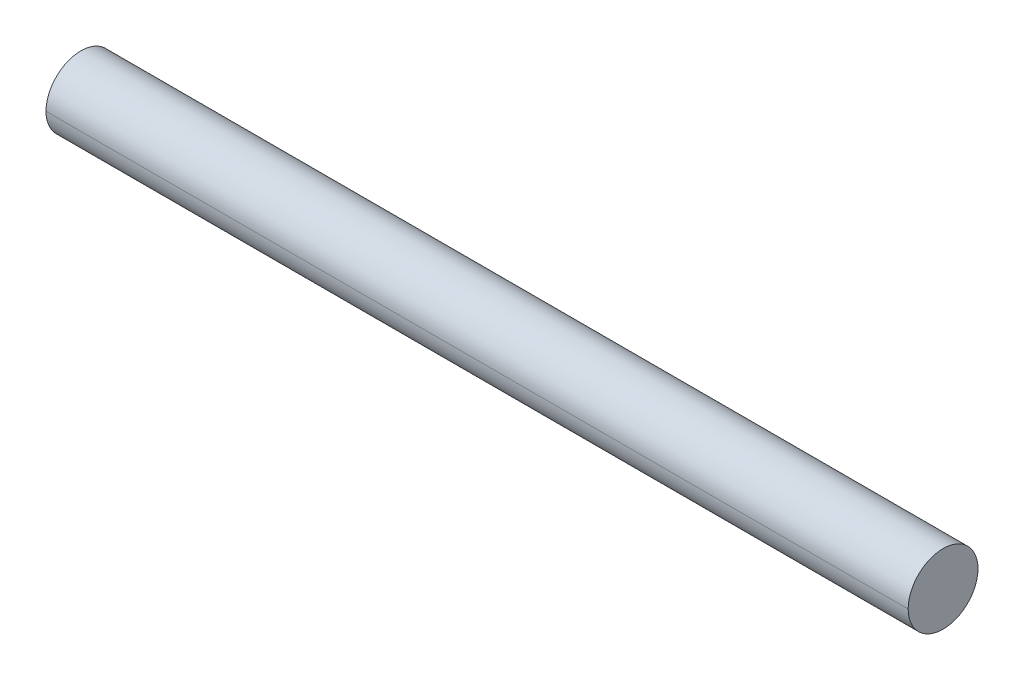
ISO-10303-21;
HEADER;
FILE_DESCRIPTION(('STEP AP214'),'2;1');
FILE_NAME('part.step','',(''),(''),'','','');
FILE_SCHEMA(('AUTOMOTIVE_DESIGN { 1 0 10303 214 1 1 1 1 }'));
ENDSEC;
DATA;
#1=APPLICATION_CONTEXT('core data for automotive mechanical design processes');
#2=APPLICATION_PROTOCOL_DEFINITION('international standard','automotive_design',2000,#1);
#3=PRODUCT_CONTEXT('',#1,'mechanical');
#4=PRODUCT('Part','Part','',(#3));
#5=PRODUCT_RELATED_PRODUCT_CATEGORY('part','',(#4));
#6=PRODUCT_DEFINITION_FORMATION('','',#4);
#7=PRODUCT_DEFINITION_CONTEXT('part definition',#1,'design');
#8=PRODUCT_DEFINITION('design','',#6,#7);
#9=PRODUCT_DEFINITION_SHAPE('','',#8);
#10=(LENGTH_UNIT() NAMED_UNIT(*) SI_UNIT(.MILLI.,.METRE.));
#11=(NAMED_UNIT(*) PLANE_ANGLE_UNIT() SI_UNIT($,.RADIAN.));
#12=(NAMED_UNIT(*) SI_UNIT($,.STERADIAN.) SOLID_ANGLE_UNIT());
#13=UNCERTAINTY_MEASURE_WITH_UNIT(LENGTH_MEASURE(1.E-05),#10,'distance_accuracy_value','');
#14=(GEOMETRIC_REPRESENTATION_CONTEXT(3) GLOBAL_UNCERTAINTY_ASSIGNED_CONTEXT((#13)) GLOBAL_UNIT_ASSIGNED_CONTEXT((#10,
#11,#12)) REPRESENTATION_CONTEXT('',''));
#15=CARTESIAN_POINT('',(0.,0.,0.));
#16=DIRECTION('',(0.,0.,1.));
#17=DIRECTION('',(1.,0.,0.));
#18=AXIS2_PLACEMENT_3D('',#15,#16,#17);
#19=CARTESIAN_POINT('',(30.861,0.,0.));
#20=DIRECTION('',(-1.,0.,0.));
#21=DIRECTION('',(0.,0.,1.));
#22=AXIS2_PLACEMENT_3D('',#19,#20,#21);
#23=CYLINDRICAL_SURFACE('',#22,2.5);
#24=CARTESIAN_POINT('',(30.861,0.,0.));
#25=DIRECTION('',(1.,0.,0.));
#26=DIRECTION('',(0.,0.,-1.));
#27=AXIS2_PLACEMENT_3D('',#24,#25,#26);
#28=CIRCLE('',#27,2.5);
#29=CARTESIAN_POINT('',(30.861,0.,-2.5));
#30=VERTEX_POINT('',#29);
#31=CARTESIAN_POINT('',(30.861,0.,2.5));
#32=VERTEX_POINT('',#31);
#33=EDGE_CURVE('E37',#30,#32,#28,.T.);
#34=ORIENTED_EDGE('',*,*,#33,.F.);
#35=DIRECTION('',(-1.,0.,0.));
#36=VECTOR('',#35,1.);
#37=CARTESIAN_POINT('',(30.861,0.,-2.5));
#38=LINE('',#37,#36);
#39=CARTESIAN_POINT('',(-30.861,0.,-2.5));
#40=VERTEX_POINT('',#39);
#41=EDGE_CURVE('E11',#30,#40,#38,.T.);
#42=ORIENTED_EDGE('',*,*,#41,.T.);
#43=CARTESIAN_POINT('',(-30.861,0.,0.));
#44=DIRECTION('',(1.,0.,0.));
#45=DIRECTION('',(0.,0.,-1.));
#46=AXIS2_PLACEMENT_3D('',#43,#44,#45);
#47=CIRCLE('',#46,2.5);
#48=CARTESIAN_POINT('',(-30.861,0.,2.5));
#49=VERTEX_POINT('',#48);
#50=EDGE_CURVE('E19',#40,#49,#47,.T.);
#51=ORIENTED_EDGE('',*,*,#50,.T.);
#52=DIRECTION('',(-1.,0.,0.));
#53=VECTOR('',#52,1.);
#54=CARTESIAN_POINT('',(30.861,0.,2.5));
#55=LINE('',#54,#53);
#56=EDGE_CURVE('E51',#32,#49,#55,.T.);
#57=ORIENTED_EDGE('',*,*,#56,.F.);
#58=EDGE_LOOP('',(#34,#42,#51,#57));
#59=FACE_BOUND('',#58,.T.);
#60=ADVANCED_FACE('F16',(#59),#23,.T.);
#61=CARTESIAN_POINT('',(30.861,0.,0.));
#62=DIRECTION('',(-1.,0.,0.));
#63=DIRECTION('',(0.,0.,1.));
#64=AXIS2_PLACEMENT_3D('',#61,#62,#63);
#65=CYLINDRICAL_SURFACE('',#64,2.5);
#66=ORIENTED_EDGE('',*,*,#41,.F.);
#67=CARTESIAN_POINT('',(30.861,0.,0.));
#68=DIRECTION('',(1.,0.,0.));
#69=DIRECTION('',(0.,0.,-1.));
#70=AXIS2_PLACEMENT_3D('',#67,#68,#69);
#71=CIRCLE('',#70,2.5);
#72=EDGE_CURVE('E57',#32,#30,#71,.T.);
#73=ORIENTED_EDGE('',*,*,#72,.F.);
#74=ORIENTED_EDGE('',*,*,#56,.T.);
#75=CARTESIAN_POINT('',(-30.861,0.,0.));
#76=DIRECTION('',(1.,0.,0.));
#77=DIRECTION('',(0.,0.,-1.));
#78=AXIS2_PLACEMENT_3D('',#75,#76,#77);
#79=CIRCLE('',#78,2.5);
#80=EDGE_CURVE('E55',#49,#40,#79,.T.);
#81=ORIENTED_EDGE('',*,*,#80,.T.);
#82=EDGE_LOOP('',(#66,#73,#74,#81));
#83=FACE_BOUND('',#82,.T.);
#84=ADVANCED_FACE('F53',(#83),#65,.T.);
#85=CARTESIAN_POINT('',(30.861,0.,0.));
#86=DIRECTION('',(1.,0.,0.));
#87=DIRECTION('',(0.,1.,0.));
#88=AXIS2_PLACEMENT_3D('',#85,#86,#87);
#89=PLANE('',#88);
#90=ORIENTED_EDGE('',*,*,#72,.T.);
#91=ORIENTED_EDGE('',*,*,#33,.T.);
#92=EDGE_LOOP('',(#90,#91));
#93=FACE_BOUND('',#92,.T.);
#94=ADVANCED_FACE('F75',(#93),#89,.T.);
#95=CARTESIAN_POINT('',(-30.861,0.,0.));
#96=DIRECTION('',(1.,0.,0.));
#97=DIRECTION('',(0.,1.,0.));
#98=AXIS2_PLACEMENT_3D('',#95,#96,#97);
#99=PLANE('',#98);
#100=ORIENTED_EDGE('',*,*,#80,.F.);
#101=ORIENTED_EDGE('',*,*,#50,.F.);
#102=EDGE_LOOP('',(#100,#101));
#103=FACE_BOUND('',#102,.T.);
#104=ADVANCED_FACE('F62',(#103),#99,.F.);
#105=CLOSED_SHELL('',(#60,#84,#94,#104));
#106=MANIFOLD_SOLID_BREP('B1',#105);
#107=ADVANCED_BREP_SHAPE_REPRESENTATION('',(#18,#106),#14);
#108=SHAPE_DEFINITION_REPRESENTATION(#9,#107);
ENDSEC;
END-ISO-10303-21;
